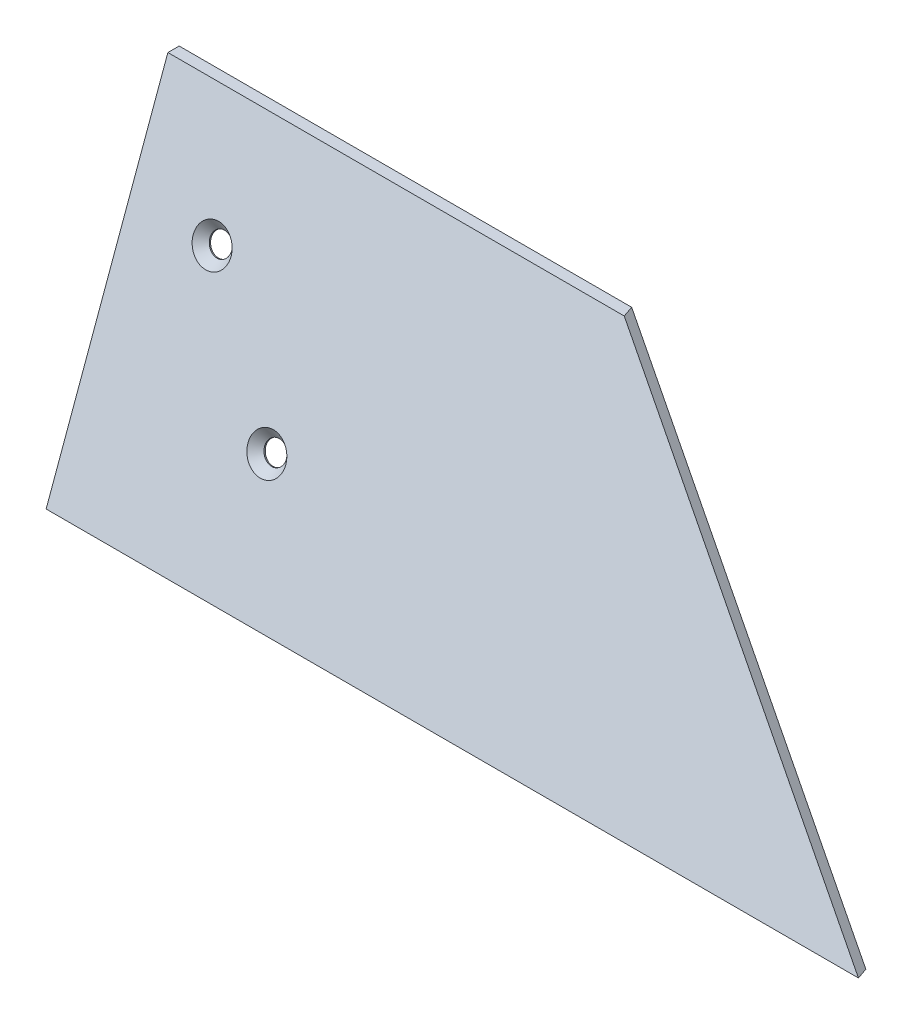
ISO-10303-21;
HEADER;
FILE_DESCRIPTION(('STEP AP214'),'2;1');
FILE_NAME('part.step','',(''),(''),'','','');
FILE_SCHEMA(('AUTOMOTIVE_DESIGN { 1 0 10303 214 1 1 1 1 }'));
ENDSEC;
DATA;
#1=APPLICATION_CONTEXT('core data for automotive mechanical design processes');
#2=APPLICATION_PROTOCOL_DEFINITION('international standard','automotive_design',2000,#1);
#3=PRODUCT_CONTEXT('',#1,'mechanical');
#4=PRODUCT('Part','Part','',(#3));
#5=PRODUCT_RELATED_PRODUCT_CATEGORY('part','',(#4));
#6=PRODUCT_DEFINITION_FORMATION('','',#4);
#7=PRODUCT_DEFINITION_CONTEXT('part definition',#1,'design');
#8=PRODUCT_DEFINITION('design','',#6,#7);
#9=PRODUCT_DEFINITION_SHAPE('','',#8);
#10=(LENGTH_UNIT() NAMED_UNIT(*) SI_UNIT(.MILLI.,.METRE.));
#11=(NAMED_UNIT(*) PLANE_ANGLE_UNIT() SI_UNIT($,.RADIAN.));
#12=(NAMED_UNIT(*) SI_UNIT($,.STERADIAN.) SOLID_ANGLE_UNIT());
#13=UNCERTAINTY_MEASURE_WITH_UNIT(LENGTH_MEASURE(1.E-05),#10,'distance_accuracy_value','');
#14=(GEOMETRIC_REPRESENTATION_CONTEXT(3) GLOBAL_UNCERTAINTY_ASSIGNED_CONTEXT((#13)) GLOBAL_UNIT_ASSIGNED_CONTEXT((#10,
#11,#12)) REPRESENTATION_CONTEXT('',''));
#15=CARTESIAN_POINT('',(0.,0.,0.));
#16=DIRECTION('',(0.,0.,1.));
#17=DIRECTION('',(1.,0.,0.));
#18=AXIS2_PLACEMENT_3D('',#15,#16,#17);
#19=CARTESIAN_POINT('',(85.,70.,-25.4779163986345));
#20=DIRECTION('',(0.,0.342020143325673,0.939692620785907));
#21=DIRECTION('',(0.,-0.939692620785907,0.342020143325673));
#22=AXIS2_PLACEMENT_3D('',#19,#20,#21);
#23=PLANE('',#22);
#24=CARTESIAN_POINT('',(-67.6378,46.9865856163312,-17.1017185741452));
#25=DIRECTION('',(0.,0.342020143325673,0.939692620785907));
#26=DIRECTION('',(0.,-0.939692620785907,0.342020143325673));
#27=AXIS2_PLACEMENT_3D('',#24,#25,#26);
#28=CIRCLE('',#27,2.28599999999999);
#29=CARTESIAN_POINT('',(-67.6378,44.8384482852146,-16.3198605265028));
#30=VERTEX_POINT('',#29);
#31=EDGE_CURVE('E46',#30,#30,#28,.T.);
#32=ORIENTED_EDGE('',*,*,#31,.T.);
#33=EDGE_LOOP('',(#32));
#34=FACE_BOUND('',#33,.T.);
#35=CARTESIAN_POINT('',(-47.6378,23.4942700966835,-8.55121499100342));
#36=DIRECTION('',(0.,0.342020143325673,0.939692620785907));
#37=DIRECTION('',(0.,-0.939692620785907,0.342020143325673));
#38=AXIS2_PLACEMENT_3D('',#35,#36,#37);
#39=CIRCLE('',#38,2.28599999999999);
#40=CARTESIAN_POINT('',(-47.6378,21.3461327655669,-7.76935694336094));
#41=VERTEX_POINT('',#40);
#42=EDGE_CURVE('E109',#41,#41,#39,.T.);
#43=ORIENTED_EDGE('',*,*,#42,.T.);
#44=EDGE_LOOP('',(#43));
#45=FACE_BOUND('',#44,.T.);
#46=DIRECTION('',(-1.,0.,0.));
#47=VECTOR('',#46,1.);
#48=CARTESIAN_POINT('',(85.,70.,-25.4779163986345));
#49=LINE('',#48,#47);
#50=CARTESIAN_POINT('',(9.6996359441229,70.,-25.4779163986345));
#51=VERTEX_POINT('',#50);
#52=CARTESIAN_POINT('',(-85.,70.,-25.4779163986345));
#53=VERTEX_POINT('',#52);
#54=EDGE_CURVE('E11',#51,#53,#49,.T.);
#55=ORIENTED_EDGE('',*,*,#54,.F.);
#56=DIRECTION('',(-0.707106781186544,0.664463024388677,-0.241844762647979));
#57=VECTOR('',#56,1.);
#58=CARTESIAN_POINT('',(85.,-0.759196445800778,0.276324908232178));
#59=LINE('',#58,#57);
#60=CARTESIAN_POINT('',(84.1920800174361,0.,0.));
#61=VERTEX_POINT('',#60);
#62=EDGE_CURVE('E137',#61,#51,#59,.T.);
#63=ORIENTED_EDGE('',*,*,#62,.F.);
#64=DIRECTION('',(-1.,0.,0.));
#65=VECTOR('',#64,1.);
#66=CARTESIAN_POINT('',(85.,0.,0.));
#67=LINE('',#66,#65);
#68=CARTESIAN_POINT('',(-85.,0.,0.));
#69=VERTEX_POINT('',#68);
#70=EDGE_CURVE('E97',#61,#69,#67,.T.);
#71=ORIENTED_EDGE('',*,*,#70,.T.);
#72=DIRECTION('',(0.,0.939692620785907,-0.342020143325673));
#73=VECTOR('',#72,1.);
#74=CARTESIAN_POINT('',(-85.,70.,-25.4779163986345));
#75=LINE('',#74,#73);
#76=EDGE_CURVE('E101',#69,#53,#75,.T.);
#77=ORIENTED_EDGE('',*,*,#76,.T.);
#78=EDGE_LOOP('',(#55,#63,#71,#77));
#79=FACE_BOUND('',#78,.T.);
#80=ADVANCED_FACE('F43',(#34,#45,#79),#23,.F.);
#81=CARTESIAN_POINT('',(85.,70.,-23.1157163986345));
#82=DIRECTION('',(0.,-1.,0.));
#83=DIRECTION('',(0.,0.,-1.));
#84=AXIS2_PLACEMENT_3D('',#81,#82,#83);
#85=PLANE('',#84);
#86=DIRECTION('',(-1.,0.,0.));
#87=VECTOR('',#86,1.);
#88=CARTESIAN_POINT('',(85.,70.,-23.1157163986345));
#89=LINE('',#88,#87);
#90=CARTESIAN_POINT('',(10.5075559266868,70.,-23.1157163986345));
#91=VERTEX_POINT('',#90);
#92=CARTESIAN_POINT('',(-85.,70.,-23.1157163986345));
#93=VERTEX_POINT('',#92);
#94=EDGE_CURVE('E53',#91,#93,#89,.T.);
#95=ORIENTED_EDGE('',*,*,#94,.F.);
#96=DIRECTION('',(0.323615577118185,0.,0.946188648339465));
#97=VECTOR('',#96,1.);
#98=CARTESIAN_POINT('',(18.5824499080621,70.,0.493694154961061));
#99=LINE('',#98,#97);
#100=EDGE_CURVE('E139',#51,#91,#99,.T.);
#101=ORIENTED_EDGE('',*,*,#100,.F.);
#102=ORIENTED_EDGE('',*,*,#54,.T.);
#103=DIRECTION('',(0.,0.,1.));
#104=VECTOR('',#103,1.);
#105=CARTESIAN_POINT('',(-85.,70.,-23.1157163986345));
#106=LINE('',#105,#104);
#107=EDGE_CURVE('E88',#53,#93,#106,.T.);
#108=ORIENTED_EDGE('',*,*,#107,.T.);
#109=EDGE_LOOP('',(#95,#101,#102,#108));
#110=FACE_BOUND('',#109,.T.);
#111=ADVANCED_FACE('F129',(#110),#85,.F.);
#112=CARTESIAN_POINT('',(85.,0.,2.3622));
#113=DIRECTION('',(0.,-0.342020143325673,-0.939692620785907));
#114=DIRECTION('',(0.,0.939692620785907,-0.342020143325673));
#115=AXIS2_PLACEMENT_3D('',#112,#113,#114);
#116=PLANE('',#115);
#117=CARTESIAN_POINT('',(-67.6378,47.7457820621319,-15.0158434823774));
#118=DIRECTION('',(0.,0.342020143325673,0.939692620785907));
#119=DIRECTION('',(0.,-0.939692620785907,0.342020143325673));
#120=AXIS2_PLACEMENT_3D('',#117,#118,#119);
#121=CIRCLE('',#120,3.96240000000001);
#122=CARTESIAN_POINT('',(-67.6378,44.0223440215299,-13.6606228664638));
#123=VERTEX_POINT('',#122);
#124=EDGE_CURVE('E144',#123,#123,#121,.T.);
#125=ORIENTED_EDGE('',*,*,#124,.F.);
#126=EDGE_LOOP('',(#125));
#127=FACE_BOUND('',#126,.T.);
#128=CARTESIAN_POINT('',(-47.6378,24.2534665424843,-6.46533989923561));
#129=DIRECTION('',(0.,0.342020143325673,0.939692620785907));
#130=DIRECTION('',(0.,-0.939692620785907,0.342020143325673));
#131=AXIS2_PLACEMENT_3D('',#128,#129,#130);
#132=CIRCLE('',#131,3.9624);
#133=CARTESIAN_POINT('',(-47.6378,20.5300285018822,-5.11011928332196));
#134=VERTEX_POINT('',#133);
#135=EDGE_CURVE('E119',#134,#134,#132,.T.);
#136=ORIENTED_EDGE('',*,*,#135,.F.);
#137=EDGE_LOOP('',(#136));
#138=FACE_BOUND('',#137,.T.);
#139=DIRECTION('',(-1.,0.,0.));
#140=VECTOR('',#139,1.);
#141=CARTESIAN_POINT('',(85.,0.,2.3622));
#142=LINE('',#141,#140);
#143=CARTESIAN_POINT('',(85.,0.,2.3622));
#144=VERTEX_POINT('',#143);
#145=CARTESIAN_POINT('',(-85.,0.,2.3622));
#146=VERTEX_POINT('',#145);
#147=EDGE_CURVE('E80',#144,#146,#142,.T.);
#148=ORIENTED_EDGE('',*,*,#147,.F.);
#149=DIRECTION('',(0.707106781186544,-0.664463024388677,0.241844762647979));
#150=VECTOR('',#149,1.);
#151=CARTESIAN_POINT('',(85.,0.,2.3622));
#152=LINE('',#151,#150);
#153=EDGE_CURVE('E61',#91,#144,#152,.T.);
#154=ORIENTED_EDGE('',*,*,#153,.F.);
#155=ORIENTED_EDGE('',*,*,#94,.T.);
#156=DIRECTION('',(0.,-0.939692620785907,0.342020143325673));
#157=VECTOR('',#156,1.);
#158=CARTESIAN_POINT('',(-85.,0.,2.3622));
#159=LINE('',#158,#157);
#160=EDGE_CURVE('E77',#93,#146,#159,.T.);
#161=ORIENTED_EDGE('',*,*,#160,.T.);
#162=EDGE_LOOP('',(#148,#154,#155,#161));
#163=FACE_BOUND('',#162,.T.);
#164=ADVANCED_FACE('F79',(#127,#138,#163),#116,.F.);
#165=CARTESIAN_POINT('',(85.,0.,0.));
#166=DIRECTION('',(0.,1.,0.));
#167=DIRECTION('',(0.,0.,1.));
#168=AXIS2_PLACEMENT_3D('',#165,#166,#167);
#169=PLANE('',#168);
#170=ORIENTED_EDGE('',*,*,#70,.F.);
#171=DIRECTION('',(-0.323615577118185,0.,-0.946188648339465));
#172=VECTOR('',#171,1.);
#173=CARTESIAN_POINT('',(77.4721473797975,0.,-19.6477686147272));
#174=LINE('',#173,#172);
#175=EDGE_CURVE('E95',#144,#61,#174,.T.);
#176=ORIENTED_EDGE('',*,*,#175,.F.);
#177=ORIENTED_EDGE('',*,*,#147,.T.);
#178=DIRECTION('',(0.,0.,-1.));
#179=VECTOR('',#178,1.);
#180=CARTESIAN_POINT('',(-85.,0.,0.));
#181=LINE('',#180,#179);
#182=EDGE_CURVE('E87',#146,#69,#181,.T.);
#183=ORIENTED_EDGE('',*,*,#182,.T.);
#184=EDGE_LOOP('',(#170,#176,#177,#183));
#185=FACE_BOUND('',#184,.T.);
#186=ADVANCED_FACE('F93',(#185),#169,.F.);
#187=CARTESIAN_POINT('',(-85.,0.,0.));
#188=DIRECTION('',(-1.,0.,0.));
#189=DIRECTION('',(0.,0.,1.));
#190=AXIS2_PLACEMENT_3D('',#187,#188,#189);
#191=PLANE('',#190);
#192=ORIENTED_EDGE('',*,*,#76,.F.);
#193=ORIENTED_EDGE('',*,*,#182,.F.);
#194=ORIENTED_EDGE('',*,*,#160,.F.);
#195=ORIENTED_EDGE('',*,*,#107,.F.);
#196=EDGE_LOOP('',(#192,#193,#194,#195));
#197=FACE_BOUND('',#196,.T.);
#198=ADVANCED_FACE('F99',(#197),#191,.T.);
#199=CARTESIAN_POINT('',(-47.6378,24.2534665424843,-6.46533989923561));
#200=DIRECTION('',(0.,0.342020143325673,0.939692620785907));
#201=DIRECTION('',(0.,-0.939692620785907,0.342020143325673));
#202=AXIS2_PLACEMENT_3D('',#199,#200,#201);
#203=CYLINDRICAL_SURFACE('',#202,2.28599999999999);
#204=CARTESIAN_POINT('',(-47.6378,23.593888358062,-8.27751606730056));
#205=DIRECTION('',(0.,0.342020143325673,0.939692620785907));
#206=DIRECTION('',(0.,-0.939692620785907,0.342020143325673));
#207=AXIS2_PLACEMENT_3D('',#204,#205,#206);
#208=CIRCLE('',#207,2.286);
#209=CARTESIAN_POINT('',(-47.6378,21.4457510269454,-7.49565801965807));
#210=VERTEX_POINT('',#209);
#211=EDGE_CURVE('E112',#210,#210,#208,.T.);
#212=ORIENTED_EDGE('',*,*,#211,.T.);
#213=EDGE_LOOP('',(#212));
#214=FACE_BOUND('',#213,.T.);
#215=ORIENTED_EDGE('',*,*,#42,.F.);
#216=EDGE_LOOP('',(#215));
#217=FACE_BOUND('',#216,.T.);
#218=ADVANCED_FACE('F172',(#214,#217),#203,.F.);
#219=CARTESIAN_POINT('',(-47.6378,24.2534665424843,-6.46533989923561));
#220=DIRECTION('',(0.,0.342020143325673,0.939692620785907));
#221=DIRECTION('',(0.,-0.939692620785907,0.342020143325673));
#222=AXIS2_PLACEMENT_3D('',#219,#220,#221);
#223=CONICAL_SURFACE('',#222,3.9624,0.715584993317676);
#224=ORIENTED_EDGE('',*,*,#211,.F.);
#225=EDGE_LOOP('',(#224));
#226=FACE_BOUND('',#225,.T.);
#227=ORIENTED_EDGE('',*,*,#135,.T.);
#228=EDGE_LOOP('',(#227));
#229=FACE_BOUND('',#228,.T.);
#230=ADVANCED_FACE('F164',(#226,#229),#223,.F.);
#231=CARTESIAN_POINT('',(-67.6378,47.7457820621319,-15.0158434823774));
#232=DIRECTION('',(0.,0.342020143325673,0.939692620785907));
#233=DIRECTION('',(0.,-0.939692620785907,0.342020143325673));
#234=AXIS2_PLACEMENT_3D('',#231,#232,#233);
#235=CYLINDRICAL_SURFACE('',#234,2.28599999999999);
#236=CARTESIAN_POINT('',(-67.6378,47.0862038777097,-16.8280196504424));
#237=DIRECTION('',(0.,0.342020143325673,0.939692620785907));
#238=DIRECTION('',(0.,-0.939692620785907,0.342020143325673));
#239=AXIS2_PLACEMENT_3D('',#236,#237,#238);
#240=CIRCLE('',#239,2.286);
#241=CARTESIAN_POINT('',(-67.6378,44.9380665465931,-16.0461616027999));
#242=VERTEX_POINT('',#241);
#243=EDGE_CURVE('E149',#242,#242,#240,.T.);
#244=ORIENTED_EDGE('',*,*,#243,.T.);
#245=EDGE_LOOP('',(#244));
#246=FACE_BOUND('',#245,.T.);
#247=ORIENTED_EDGE('',*,*,#31,.F.);
#248=EDGE_LOOP('',(#247));
#249=FACE_BOUND('',#248,.T.);
#250=ADVANCED_FACE('F161',(#246,#249),#235,.F.);
#251=CARTESIAN_POINT('',(-67.6378,47.7457820621319,-15.0158434823774));
#252=DIRECTION('',(0.,0.342020143325673,0.939692620785907));
#253=DIRECTION('',(0.,-0.939692620785907,0.342020143325673));
#254=AXIS2_PLACEMENT_3D('',#251,#252,#253);
#255=CONICAL_SURFACE('',#254,3.96240000000001,0.715584993317678);
#256=ORIENTED_EDGE('',*,*,#243,.F.);
#257=EDGE_LOOP('',(#256));
#258=FACE_BOUND('',#257,.T.);
#259=ORIENTED_EDGE('',*,*,#124,.T.);
#260=EDGE_LOOP('',(#259));
#261=FACE_BOUND('',#260,.T.);
#262=ADVANCED_FACE('F163',(#258,#261),#255,.F.);
#263=CARTESIAN_POINT('',(85.,-8.94807930822002,-22.2224458468233));
#264=DIRECTION('',(-0.707106781186551,-0.66446302438867,0.241844762647977));
#265=DIRECTION('',(0.684791078771732,-0.728739444818687,0.));
#266=AXIS2_PLACEMENT_3D('',#263,#264,#265);
#267=PLANE('',#266);
#268=ORIENTED_EDGE('',*,*,#100,.T.);
#269=ORIENTED_EDGE('',*,*,#153,.T.);
#270=ORIENTED_EDGE('',*,*,#175,.T.);
#271=ORIENTED_EDGE('',*,*,#62,.T.);
#272=EDGE_LOOP('',(#268,#269,#270,#271));
#273=FACE_BOUND('',#272,.T.);
#274=ADVANCED_FACE('F140',(#273),#267,.F.);
#275=CLOSED_SHELL('',(#80,#111,#164,#186,#198,#218,#230,#250,#262,#274));
#276=MANIFOLD_SOLID_BREP('B2',#275);
#277=ADVANCED_BREP_SHAPE_REPRESENTATION('',(#18,#276),#14);
#278=SHAPE_DEFINITION_REPRESENTATION(#9,#277);
ENDSEC;
END-ISO-10303-21;
